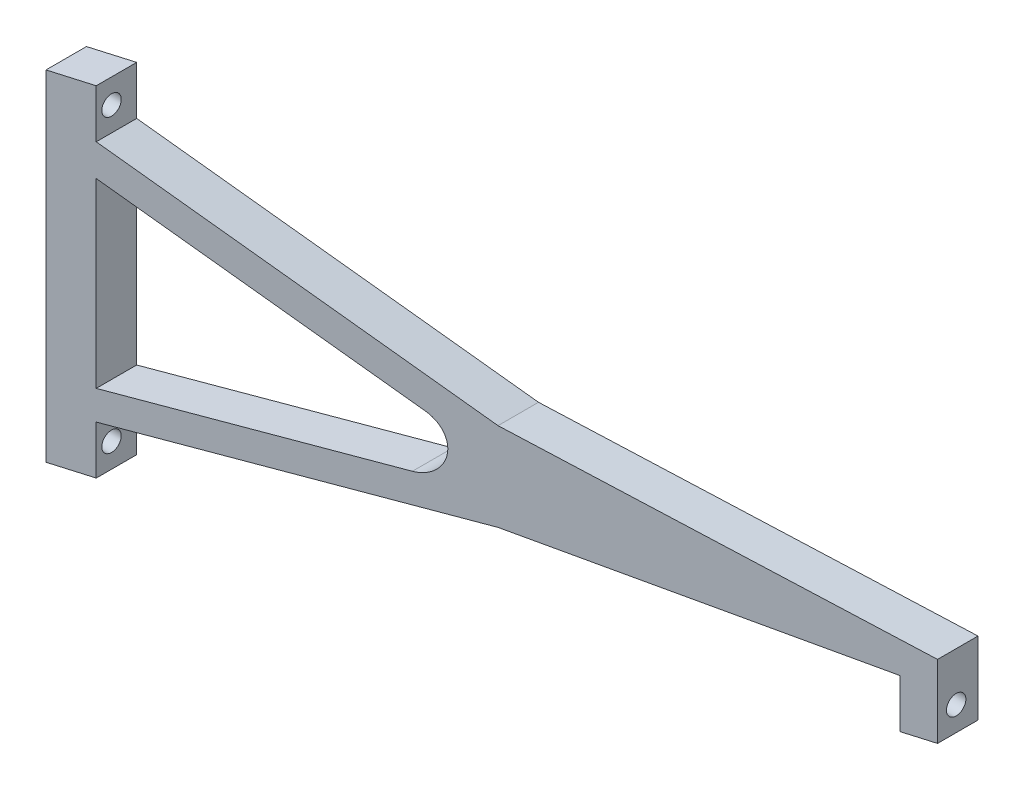
ISO-10303-21;
HEADER;
FILE_DESCRIPTION(('STEP AP214'),'2;1');
FILE_NAME('part.step','',(''),(''),'','','');
FILE_SCHEMA(('AUTOMOTIVE_DESIGN { 1 0 10303 214 1 1 1 1 }'));
ENDSEC;
DATA;
#1=APPLICATION_CONTEXT('core data for automotive mechanical design processes');
#2=APPLICATION_PROTOCOL_DEFINITION('international standard','automotive_design',2000,#1);
#3=PRODUCT_CONTEXT('',#1,'mechanical');
#4=PRODUCT('Part','Part','',(#3));
#5=PRODUCT_RELATED_PRODUCT_CATEGORY('part','',(#4));
#6=PRODUCT_DEFINITION_FORMATION('','',#4);
#7=PRODUCT_DEFINITION_CONTEXT('part definition',#1,'design');
#8=PRODUCT_DEFINITION('design','',#6,#7);
#9=PRODUCT_DEFINITION_SHAPE('','',#8);
#10=(LENGTH_UNIT() NAMED_UNIT(*) SI_UNIT(.MILLI.,.METRE.));
#11=(NAMED_UNIT(*) PLANE_ANGLE_UNIT() SI_UNIT($,.RADIAN.));
#12=(NAMED_UNIT(*) SI_UNIT($,.STERADIAN.) SOLID_ANGLE_UNIT());
#13=UNCERTAINTY_MEASURE_WITH_UNIT(LENGTH_MEASURE(1.E-05),#10,'distance_accuracy_value','');
#14=(GEOMETRIC_REPRESENTATION_CONTEXT(3) GLOBAL_UNCERTAINTY_ASSIGNED_CONTEXT((#13)) GLOBAL_UNIT_ASSIGNED_CONTEXT((#10,
#11,#12)) REPRESENTATION_CONTEXT('',''));
#15=CARTESIAN_POINT('',(0.,0.,0.));
#16=DIRECTION('',(0.,0.,1.));
#17=DIRECTION('',(1.,0.,0.));
#18=AXIS2_PLACEMENT_3D('',#15,#16,#17);
#19=CARTESIAN_POINT('',(-64.,16.0106379265945,30.));
#20=DIRECTION('',(-0.0594690450469109,0.99823015015637,0.));
#21=DIRECTION('',(-0.99823015015637,-0.0594690450469109,0.));
#22=AXIS2_PLACEMENT_3D('',#19,#20,#21);
#23=PLANE('',#22);
#24=DIRECTION('',(0.957987763405682,0.0570716256641193,-0.28107343294775));
#25=VECTOR('',#24,1.);
#26=CARTESIAN_POINT('',(-69.5695897519318,15.6788324969563,10.949691869991));
#27=LINE('',#26,#25);
#28=CARTESIAN_POINT('',(-64.,16.0106379265945,9.31557526486776));
#29=VERTEX_POINT('',#28);
#30=CARTESIAN_POINT('',(-13.6431857297185,19.0106190990618,-5.45910474664132));
#31=VERTEX_POINT('',#30);
#32=EDGE_CURVE('E11',#29,#31,#27,.T.);
#33=ORIENTED_EDGE('',*,*,#32,.F.);
#34=DIRECTION('',(0.,0.,-1.));
#35=VECTOR('',#34,1.);
#36=CARTESIAN_POINT('',(-64.,16.0106379265945,30.));
#37=LINE('',#36,#35);
#38=CARTESIAN_POINT('',(-64.,16.0106379265945,17.6528014767243));
#39=VERTEX_POINT('',#38);
#40=EDGE_CURVE('E237',#39,#29,#37,.T.);
#41=ORIENTED_EDGE('',*,*,#40,.F.);
#42=DIRECTION('',(-0.957987763405682,-0.0570716256641193,0.281073432947749));
#43=VECTOR('',#42,1.);
#44=CARTESIAN_POINT('',(-67.324667291496,15.8125725917687,18.6282582463471));
#45=LINE('',#44,#43);
#46=CARTESIAN_POINT('',(-13.6431857297185,19.0106190990618,2.87812146521523));
#47=VERTEX_POINT('',#46);
#48=EDGE_CURVE('E45',#47,#39,#45,.T.);
#49=ORIENTED_EDGE('',*,*,#48,.F.);
#50=DIRECTION('',(0.,0.,-1.));
#51=VECTOR('',#50,1.);
#52=CARTESIAN_POINT('',(-13.6431857297185,19.0106190990618,30.));
#53=LINE('',#52,#51);
#54=EDGE_CURVE('E234',#47,#31,#53,.T.);
#55=ORIENTED_EDGE('',*,*,#54,.T.);
#56=EDGE_LOOP('',(#33,#41,#49,#55));
#57=FACE_BOUND('',#56,.T.);
#58=ADVANCED_FACE('F37',(#57),#23,.T.);
#59=CARTESIAN_POINT('',(-64.,53.4497295583817,30.));
#60=DIRECTION('',(1.,0.,0.));
#61=DIRECTION('',(0.,0.,-1.));
#62=AXIS2_PLACEMENT_3D('',#59,#60,#61);
#63=PLANE('',#62);
#64=DIRECTION('',(0.,-1.,0.));
#65=VECTOR('',#64,1.);
#66=CARTESIAN_POINT('',(-64.,53.4497295583817,9.31557526486777));
#67=LINE('',#66,#65);
#68=CARTESIAN_POINT('',(-64.,53.4497295583817,9.31557526486777));
#69=VERTEX_POINT('',#68);
#70=EDGE_CURVE('E211',#69,#29,#67,.T.);
#71=ORIENTED_EDGE('',*,*,#70,.F.);
#72=DIRECTION('',(0.,0.,-1.));
#73=VECTOR('',#72,1.);
#74=CARTESIAN_POINT('',(-64.,53.4497295583817,30.));
#75=LINE('',#74,#73);
#76=CARTESIAN_POINT('',(-64.,53.4497295583817,17.6528014767243));
#77=VERTEX_POINT('',#76);
#78=EDGE_CURVE('E240',#77,#69,#75,.T.);
#79=ORIENTED_EDGE('',*,*,#78,.F.);
#80=DIRECTION('',(0.,1.,0.));
#81=VECTOR('',#80,1.);
#82=CARTESIAN_POINT('',(-64.,53.4497295583817,17.6528014767243));
#83=LINE('',#82,#81);
#84=EDGE_CURVE('E180',#39,#77,#83,.T.);
#85=ORIENTED_EDGE('',*,*,#84,.F.);
#86=ORIENTED_EDGE('',*,*,#40,.T.);
#87=EDGE_LOOP('',(#71,#79,#85,#86));
#88=FACE_BOUND('',#87,.T.);
#89=ADVANCED_FACE('F278',(#88),#63,.T.);
#90=CARTESIAN_POINT('',(-11.5928306007203,30.4959562846853,30.));
#91=DIRECTION('',(-0.401194899879948,-0.915992714114211,0.));
#92=DIRECTION('',(0.915992714114211,-0.401194899879948,0.));
#93=AXIS2_PLACEMENT_3D('',#90,#91,#92);
#94=PLANE('',#93);
#95=DIRECTION('',(-0.884603208938995,0.387446636174346,0.259542418213318));
#96=VECTOR('',#95,1.);
#97=CARTESIAN_POINT('',(-19.8720759330204,34.1221761781325,-3.63154951078674));
#98=LINE('',#97,#96);
#99=CARTESIAN_POINT('',(-11.5928306007203,30.4959562846853,-6.06067856301324));
#100=VERTEX_POINT('',#99);
#101=EDGE_CURVE('E213',#100,#69,#98,.T.);
#102=ORIENTED_EDGE('',*,*,#101,.F.);
#103=DIRECTION('',(0.,0.,-1.));
#104=VECTOR('',#103,1.);
#105=CARTESIAN_POINT('',(-11.5928306007203,30.4959562846853,30.));
#106=LINE('',#105,#104);
#107=CARTESIAN_POINT('',(-11.5928306007203,30.4959562846853,2.2765476488433));
#108=VERTEX_POINT('',#107);
#109=EDGE_CURVE('E243',#108,#100,#106,.T.);
#110=ORIENTED_EDGE('',*,*,#109,.F.);
#111=DIRECTION('',(0.884603208938995,-0.387446636174346,-0.259542418213318));
#112=VECTOR('',#111,1.);
#113=CARTESIAN_POINT('',(-17.9579150256424,33.2837944074519,4.14406224418109));
#114=LINE('',#113,#112);
#115=EDGE_CURVE('E183',#77,#108,#114,.T.);
#116=ORIENTED_EDGE('',*,*,#115,.F.);
#117=ORIENTED_EDGE('',*,*,#78,.T.);
#118=EDGE_LOOP('',(#102,#110,#116,#117));
#119=FACE_BOUND('',#118,.T.);
#120=ADVANCED_FACE('F281',(#119),#94,.T.);
#121=CARTESIAN_POINT('',(-14.,25.,30.));
#122=DIRECTION('',(0.,0.,-1.));
#123=DIRECTION('',(-1.,0.,0.));
#124=AXIS2_PLACEMENT_3D('',#121,#122,#123);
#125=CYLINDRICAL_SURFACE('',#124,6.);
#126=CARTESIAN_POINT('',(-14.,25.,-5.35441550560528));
#127=DIRECTION('',(0.281532306264845,0.,0.959551749792161));
#128=DIRECTION('',(0.959551749792161,0.,-0.281532306264845));
#129=AXIS2_PLACEMENT_3D('',#126,#127,#128);
#130=ELLIPSE('',#129,6.25291965889239,6.);
#131=EDGE_CURVE('E215',#31,#100,#130,.T.);
#132=ORIENTED_EDGE('',*,*,#131,.F.);
#133=ORIENTED_EDGE('',*,*,#54,.F.);
#134=CARTESIAN_POINT('',(-14.,25.,2.98281070625127));
#135=DIRECTION('',(-0.281532306264845,0.,-0.959551749792161));
#136=DIRECTION('',(0.959551749792161,0.,-0.281532306264845));
#137=AXIS2_PLACEMENT_3D('',#134,#135,#136);
#138=ELLIPSE('',#137,6.25291965889239,6.);
#139=EDGE_CURVE('E191',#108,#47,#138,.T.);
#140=ORIENTED_EDGE('',*,*,#139,.F.);
#141=ORIENTED_EDGE('',*,*,#109,.T.);
#142=EDGE_LOOP('',(#132,#133,#140,#141));
#143=FACE_BOUND('',#142,.T.);
#144=ADVANCED_FACE('F284',(#143),#125,.F.);
#145=CARTESIAN_POINT('',(70.,70.,-21.6627737881434));
#146=DIRECTION('',(-0.281532306264845,0.,-0.959551749792161));
#147=DIRECTION('',(-0.959551749792161,0.,0.281532306264845));
#148=AXIS2_PLACEMENT_3D('',#145,#146,#147);
#149=PLANE('',#148);
#150=ORIENTED_EDGE('',*,*,#139,.T.);
#151=ORIENTED_EDGE('',*,*,#48,.T.);
#152=ORIENTED_EDGE('',*,*,#84,.T.);
#153=ORIENTED_EDGE('',*,*,#115,.T.);
#154=EDGE_LOOP('',(#150,#151,#152,#153));
#155=FACE_BOUND('',#154,.T.);
#156=DIRECTION('',(0.884603208938995,-0.387446636174346,-0.259542418213318));
#157=VECTOR('',#156,1.);
#158=CARTESIAN_POINT('',(-7.14600377341808,35.0985646802269,0.971849478554998));
#159=LINE('',#158,#157);
#160=CARTESIAN_POINT('',(-64.,60.,17.6528014767243));
#161=VERTEX_POINT('',#160);
#162=CARTESIAN_POINT('',(0.,31.9686923305427,-1.12478670948118));
#163=VERTEX_POINT('',#162);
#164=EDGE_CURVE('E205',#161,#163,#159,.T.);
#165=ORIENTED_EDGE('',*,*,#164,.F.);
#166=DIRECTION('',(0.,-1.,0.));
#167=VECTOR('',#166,1.);
#168=CARTESIAN_POINT('',(-64.,60.,17.6528014767243));
#169=LINE('',#168,#167);
#170=CARTESIAN_POINT('',(-64.,70.,17.6528014767243));
#171=VERTEX_POINT('',#170);
#172=EDGE_CURVE('E202',#171,#161,#169,.T.);
#173=ORIENTED_EDGE('',*,*,#172,.F.);
#174=DIRECTION('',(0.959551749792161,0.,-0.281532306264845));
#175=VECTOR('',#174,1.);
#176=CARTESIAN_POINT('',(70.,70.,-21.6627737881434));
#177=LINE('',#176,#175);
#178=CARTESIAN_POINT('',(-72.,70.,20.));
#179=VERTEX_POINT('',#178);
#180=EDGE_CURVE('E172',#179,#171,#177,.T.);
#181=ORIENTED_EDGE('',*,*,#180,.F.);
#182=DIRECTION('',(0.,-1.,0.));
#183=VECTOR('',#182,1.);
#184=CARTESIAN_POINT('',(-72.,70.,20.));
#185=LINE('',#184,#183);
#186=CARTESIAN_POINT('',(-72.,0.,20.));
#187=VERTEX_POINT('',#186);
#188=EDGE_CURVE('E159',#179,#187,#185,.T.);
#189=ORIENTED_EDGE('',*,*,#188,.T.);
#190=DIRECTION('',(0.959551749792161,0.,-0.281532306264845));
#191=VECTOR('',#190,1.);
#192=CARTESIAN_POINT('',(70.,0.,-21.6627737881434));
#193=LINE('',#192,#191);
#194=CARTESIAN_POINT('',(-64.,0.,17.6528014767243));
#195=VERTEX_POINT('',#194);
#196=EDGE_CURVE('E173',#187,#195,#193,.T.);
#197=ORIENTED_EDGE('',*,*,#196,.T.);
#198=DIRECTION('',(0.,-1.,0.));
#199=VECTOR('',#198,1.);
#200=CARTESIAN_POINT('',(-64.,0.,17.6528014767243));
#201=LINE('',#200,#199);
#202=CARTESIAN_POINT('',(-64.,10.,17.6528014767243));
#203=VERTEX_POINT('',#202);
#204=EDGE_CURVE('E195',#203,#195,#201,.T.);
#205=ORIENTED_EDGE('',*,*,#204,.F.);
#206=DIRECTION('',(-0.957987763405682,-0.0570716256641194,0.281073432947749));
#207=VECTOR('',#206,1.);
#208=CARTESIAN_POINT('',(-67.324667291496,9.80193466517416,18.6282582463471));
#209=LINE('',#208,#207);
#210=CARTESIAN_POINT('',(0.,13.8127669079181,-1.12478670948117));
#211=VERTEX_POINT('',#210);
#212=EDGE_CURVE('E193',#211,#203,#209,.T.);
#213=ORIENTED_EDGE('',*,*,#212,.F.);
#214=DIRECTION('',(-0.957987763405682,0.0570716256641194,0.281073432947749));
#215=VECTOR('',#214,1.);
#216=CARTESIAN_POINT('',(-8.38081287287409,14.3120495014048,1.33414224040131));
#217=LINE('',#216,#215);
#218=CARTESIAN_POINT('',(64.,10.,-19.9023748956867));
#219=VERTEX_POINT('',#218);
#220=EDGE_CURVE('E197',#219,#211,#217,.T.);
#221=ORIENTED_EDGE('',*,*,#220,.F.);
#222=DIRECTION('',(0.,1.,0.));
#223=VECTOR('',#222,1.);
#224=CARTESIAN_POINT('',(64.,10.,-19.9023748956867));
#225=LINE('',#224,#223);
#226=CARTESIAN_POINT('',(64.,0.,-19.9023748956867));
#227=VERTEX_POINT('',#226);
#228=EDGE_CURVE('E199',#227,#219,#225,.T.);
#229=ORIENTED_EDGE('',*,*,#228,.F.);
#230=CARTESIAN_POINT('',(70.,0.,-21.6627737881434));
#231=VERTEX_POINT('',#230);
#232=EDGE_CURVE('E359',#227,#231,#193,.T.);
#233=ORIENTED_EDGE('',*,*,#232,.T.);
#234=DIRECTION('',(0.,-1.,0.));
#235=VECTOR('',#234,1.);
#236=CARTESIAN_POINT('',(70.,70.,-21.6627737881434));
#237=LINE('',#236,#235);
#238=CARTESIAN_POINT('',(70.,15.,-21.6627737881434));
#239=VERTEX_POINT('',#238);
#240=EDGE_CURVE('E185',#239,#231,#237,.T.);
#241=ORIENTED_EDGE('',*,*,#240,.F.);
#242=DIRECTION('',(0.934601477354737,-0.226556641727189,-0.274211900937289));
#243=VECTOR('',#242,1.);
#244=CARTESIAN_POINT('',(56.7599238633365,18.2095254056572,-17.7781378936391));
#245=LINE('',#244,#243);
#246=EDGE_CURVE('E208',#163,#239,#245,.T.);
#247=ORIENTED_EDGE('',*,*,#246,.F.);
#248=EDGE_LOOP('',(#165,#173,#181,#189,#197,#205,#213,#221,#229,#233,#241,#247));
#249=FACE_BOUND('',#248,.T.);
#250=ADVANCED_FACE('F270',(#155,#249),#149,.F.);
#251=CARTESIAN_POINT('',(-72.,70.,11.6627737881435));
#252=DIRECTION('',(0.281532306264845,0.,0.959551749792161));
#253=DIRECTION('',(0.959551749792161,0.,-0.281532306264845));
#254=AXIS2_PLACEMENT_3D('',#251,#252,#253);
#255=PLANE('',#254);
#256=ORIENTED_EDGE('',*,*,#131,.T.);
#257=ORIENTED_EDGE('',*,*,#101,.T.);
#258=ORIENTED_EDGE('',*,*,#70,.T.);
#259=ORIENTED_EDGE('',*,*,#32,.T.);
#260=EDGE_LOOP('',(#256,#257,#258,#259));
#261=FACE_BOUND('',#260,.T.);
#262=DIRECTION('',(0.,1.,0.));
#263=VECTOR('',#262,1.);
#264=CARTESIAN_POINT('',(70.,0.,-30.));
#265=LINE('',#264,#263);
#266=CARTESIAN_POINT('',(70.,0.,-30.));
#267=VERTEX_POINT('',#266);
#268=CARTESIAN_POINT('',(70.,15.,-30.));
#269=VERTEX_POINT('',#268);
#270=EDGE_CURVE('E246',#267,#269,#265,.T.);
#271=ORIENTED_EDGE('',*,*,#270,.F.);
#272=DIRECTION('',(-0.959551749792161,0.,0.281532306264845));
#273=VECTOR('',#272,1.);
#274=CARTESIAN_POINT('',(-72.,0.,11.6627737881435));
#275=LINE('',#274,#273);
#276=CARTESIAN_POINT('',(64.,0.,-28.2396011075432));
#277=VERTEX_POINT('',#276);
#278=EDGE_CURVE('E357',#267,#277,#275,.T.);
#279=ORIENTED_EDGE('',*,*,#278,.T.);
#280=DIRECTION('',(0.,-1.,0.));
#281=VECTOR('',#280,1.);
#282=CARTESIAN_POINT('',(64.,10.,-28.2396011075432));
#283=LINE('',#282,#281);
#284=CARTESIAN_POINT('',(64.,10.,-28.2396011075432));
#285=VERTEX_POINT('',#284);
#286=EDGE_CURVE('E223',#285,#277,#283,.T.);
#287=ORIENTED_EDGE('',*,*,#286,.F.);
#288=DIRECTION('',(0.957987763405682,-0.0570716256641194,-0.28107343294775));
#289=VECTOR('',#288,1.);
#290=CARTESIAN_POINT('',(-10.62573533331,14.4457895962171,-6.3444241359548));
#291=LINE('',#290,#289);
#292=CARTESIAN_POINT('',(0.,13.8127669079181,-9.46201292133772));
#293=VERTEX_POINT('',#292);
#294=EDGE_CURVE('E221',#293,#285,#291,.T.);
#295=ORIENTED_EDGE('',*,*,#294,.F.);
#296=DIRECTION('',(0.957987763405682,0.0570716256641194,-0.28107343294775));
#297=VECTOR('',#296,1.);
#298=CARTESIAN_POINT('',(-69.5695897519318,9.66819457036179,10.949691869991));
#299=LINE('',#298,#297);
#300=CARTESIAN_POINT('',(-64.,10.,9.31557526486777));
#301=VERTEX_POINT('',#300);
#302=EDGE_CURVE('E217',#301,#293,#299,.T.);
#303=ORIENTED_EDGE('',*,*,#302,.F.);
#304=DIRECTION('',(0.,1.,0.));
#305=VECTOR('',#304,1.);
#306=CARTESIAN_POINT('',(-64.,0.,9.31557526486777));
#307=LINE('',#306,#305);
#308=CARTESIAN_POINT('',(-64.,0.,9.31557526486776));
#309=VERTEX_POINT('',#308);
#310=EDGE_CURVE('E219',#309,#301,#307,.T.);
#311=ORIENTED_EDGE('',*,*,#310,.F.);
#312=CARTESIAN_POINT('',(-72.,0.,11.6627737881435));
#313=VERTEX_POINT('',#312);
#314=EDGE_CURVE('E179',#309,#313,#275,.T.);
#315=ORIENTED_EDGE('',*,*,#314,.T.);
#316=DIRECTION('',(0.,-1.,0.));
#317=VECTOR('',#316,1.);
#318=CARTESIAN_POINT('',(-72.,70.,11.6627737881435));
#319=LINE('',#318,#317);
#320=CARTESIAN_POINT('',(-72.,70.,11.6627737881435));
#321=VERTEX_POINT('',#320);
#322=EDGE_CURVE('E156',#321,#313,#319,.T.);
#323=ORIENTED_EDGE('',*,*,#322,.F.);
#324=DIRECTION('',(-0.959551749792161,0.,0.281532306264845));
#325=VECTOR('',#324,1.);
#326=CARTESIAN_POINT('',(-72.,70.,11.6627737881435));
#327=LINE('',#326,#325);
#328=CARTESIAN_POINT('',(-64.,70.,9.31557526486776));
#329=VERTEX_POINT('',#328);
#330=EDGE_CURVE('E167',#329,#321,#327,.T.);
#331=ORIENTED_EDGE('',*,*,#330,.F.);
#332=DIRECTION('',(0.,1.,0.));
#333=VECTOR('',#332,1.);
#334=CARTESIAN_POINT('',(-64.,60.,9.31557526486777));
#335=LINE('',#334,#333);
#336=CARTESIAN_POINT('',(-64.,60.,9.31557526486777));
#337=VERTEX_POINT('',#336);
#338=EDGE_CURVE('E226',#337,#329,#335,.T.);
#339=ORIENTED_EDGE('',*,*,#338,.F.);
#340=DIRECTION('',(-0.884603208938995,0.387446636174346,0.259542418213318));
#341=VECTOR('',#340,1.);
#342=CARTESIAN_POINT('',(-9.06016468079608,35.9369464509075,-6.80376227641284));
#343=LINE('',#342,#341);
#344=CARTESIAN_POINT('',(0.,31.9686923305427,-9.46201292133773));
#345=VERTEX_POINT('',#344);
#346=EDGE_CURVE('E228',#345,#337,#343,.T.);
#347=ORIENTED_EDGE('',*,*,#346,.F.);
#348=DIRECTION('',(-0.934601477354737,0.226556641727189,0.274211900937289));
#349=VECTOR('',#348,1.);
#350=CARTESIAN_POINT('',(54.6232691365455,18.7274716438789,-25.4884700030615));
#351=LINE('',#350,#349);
#352=EDGE_CURVE('E231',#269,#345,#351,.T.);
#353=ORIENTED_EDGE('',*,*,#352,.F.);
#354=EDGE_LOOP('',(#271,#279,#287,#295,#303,#311,#315,#323,#331,#339,#347,#353));
#355=FACE_BOUND('',#354,.T.);
#356=ADVANCED_FACE('F176',(#261,#355),#255,.F.);
#357=CARTESIAN_POINT('',(0.,13.8127669079181,30.));
#358=DIRECTION('',(0.0594690450469109,0.99823015015637,0.));
#359=DIRECTION('',(-0.99823015015637,0.0594690450469109,0.));
#360=AXIS2_PLACEMENT_3D('',#357,#358,#359);
#361=PLANE('',#360);
#362=DIRECTION('',(0.,0.,-1.));
#363=VECTOR('',#362,1.);
#364=CARTESIAN_POINT('',(0.,13.8127669079181,30.));
#365=LINE('',#364,#363);
#366=EDGE_CURVE('E60',#211,#293,#365,.T.);
#367=ORIENTED_EDGE('',*,*,#366,.T.);
#368=ORIENTED_EDGE('',*,*,#294,.T.);
#369=DIRECTION('',(0.,0.,-1.));
#370=VECTOR('',#369,1.);
#371=CARTESIAN_POINT('',(64.,10.,30.));
#372=LINE('',#371,#370);
#373=EDGE_CURVE('E265',#219,#285,#372,.T.);
#374=ORIENTED_EDGE('',*,*,#373,.F.);
#375=ORIENTED_EDGE('',*,*,#220,.T.);
#376=EDGE_LOOP('',(#367,#368,#374,#375));
#377=FACE_BOUND('',#376,.T.);
#378=ADVANCED_FACE('F39',(#377),#361,.F.);
#379=CARTESIAN_POINT('',(64.,10.,30.));
#380=DIRECTION('',(1.,0.,0.));
#381=DIRECTION('',(0.,0.,-1.));
#382=AXIS2_PLACEMENT_3D('',#379,#380,#381);
#383=PLANE('',#382);
#384=CARTESIAN_POINT('',(64.,5.,-25.5));
#385=DIRECTION('',(1.,0.,0.));
#386=DIRECTION('',(0.,0.,-1.));
#387=AXIS2_PLACEMENT_3D('',#384,#385,#386);
#388=CIRCLE('',#387,2.);
#389=CARTESIAN_POINT('',(64.,5.,-27.5));
#390=VERTEX_POINT('',#389);
#391=EDGE_CURVE('E349',#390,#390,#388,.F.);
#392=ORIENTED_EDGE('',*,*,#391,.F.);
#393=EDGE_LOOP('',(#392));
#394=FACE_BOUND('',#393,.T.);
#395=ORIENTED_EDGE('',*,*,#373,.T.);
#396=ORIENTED_EDGE('',*,*,#286,.T.);
#397=DIRECTION('',(0.,0.,-1.));
#398=VECTOR('',#397,1.);
#399=CARTESIAN_POINT('',(64.,0.,30.));
#400=LINE('',#399,#398);
#401=EDGE_CURVE('E263',#227,#277,#400,.T.);
#402=ORIENTED_EDGE('',*,*,#401,.F.);
#403=ORIENTED_EDGE('',*,*,#228,.T.);
#404=EDGE_LOOP('',(#395,#396,#402,#403));
#405=FACE_BOUND('',#404,.T.);
#406=ADVANCED_FACE('F292',(#394,#405),#383,.F.);
#407=CARTESIAN_POINT('',(64.,0.,30.));
#408=DIRECTION('',(0.,1.,0.));
#409=DIRECTION('',(0.,0.,1.));
#410=AXIS2_PLACEMENT_3D('',#407,#408,#409);
#411=PLANE('',#410);
#412=ORIENTED_EDGE('',*,*,#401,.T.);
#413=ORIENTED_EDGE('',*,*,#278,.F.);
#414=DIRECTION('',(0.,0.,-1.));
#415=VECTOR('',#414,1.);
#416=CARTESIAN_POINT('',(70.,0.,30.));
#417=LINE('',#416,#415);
#418=EDGE_CURVE('E261',#231,#267,#417,.T.);
#419=ORIENTED_EDGE('',*,*,#418,.F.);
#420=ORIENTED_EDGE('',*,*,#232,.F.);
#421=EDGE_LOOP('',(#412,#413,#419,#420));
#422=FACE_BOUND('',#421,.T.);
#423=ADVANCED_FACE('F338',(#422),#411,.F.);
#424=CARTESIAN_POINT('',(70.,0.,30.));
#425=DIRECTION('',(-1.,0.,0.));
#426=DIRECTION('',(0.,0.,1.));
#427=AXIS2_PLACEMENT_3D('',#424,#425,#426);
#428=PLANE('',#427);
#429=CARTESIAN_POINT('',(70.,5.,-25.5));
#430=DIRECTION('',(1.,0.,0.));
#431=DIRECTION('',(0.,0.,-1.));
#432=AXIS2_PLACEMENT_3D('',#429,#430,#431);
#433=CIRCLE('',#432,2.);
#434=CARTESIAN_POINT('',(70.,5.,-27.5));
#435=VERTEX_POINT('',#434);
#436=EDGE_CURVE('E391',#435,#435,#433,.T.);
#437=ORIENTED_EDGE('',*,*,#436,.F.);
#438=EDGE_LOOP('',(#437));
#439=FACE_BOUND('',#438,.T.);
#440=DIRECTION('',(0.,0.,-1.));
#441=VECTOR('',#440,1.);
#442=CARTESIAN_POINT('',(70.,15.,30.));
#443=LINE('',#442,#441);
#444=EDGE_CURVE('E259',#239,#269,#443,.T.);
#445=ORIENTED_EDGE('',*,*,#444,.F.);
#446=ORIENTED_EDGE('',*,*,#240,.T.);
#447=ORIENTED_EDGE('',*,*,#418,.T.);
#448=ORIENTED_EDGE('',*,*,#270,.T.);
#449=EDGE_LOOP('',(#445,#446,#447,#448));
#450=FACE_BOUND('',#449,.T.);
#451=ADVANCED_FACE('F334',(#439,#450),#428,.F.);
#452=CARTESIAN_POINT('',(70.,15.,30.));
#453=DIRECTION('',(-0.235586851791364,-0.971853299249961,0.));
#454=DIRECTION('',(0.971853299249961,-0.235586851791364,0.));
#455=AXIS2_PLACEMENT_3D('',#452,#453,#454);
#456=PLANE('',#455);
#457=ORIENTED_EDGE('',*,*,#444,.T.);
#458=ORIENTED_EDGE('',*,*,#352,.T.);
#459=DIRECTION('',(0.,0.,-1.));
#460=VECTOR('',#459,1.);
#461=CARTESIAN_POINT('',(0.,31.9686923305427,30.));
#462=LINE('',#461,#460);
#463=EDGE_CURVE('E257',#163,#345,#462,.T.);
#464=ORIENTED_EDGE('',*,*,#463,.F.);
#465=ORIENTED_EDGE('',*,*,#246,.T.);
#466=EDGE_LOOP('',(#457,#458,#464,#465));
#467=FACE_BOUND('',#466,.T.);
#468=ADVANCED_FACE('F330',(#467),#456,.F.);
#469=CARTESIAN_POINT('',(0.,31.9686923305427,30.));
#470=DIRECTION('',(-0.401194899879948,-0.915992714114211,0.));
#471=DIRECTION('',(0.915992714114211,-0.401194899879948,0.));
#472=AXIS2_PLACEMENT_3D('',#469,#470,#471);
#473=PLANE('',#472);
#474=ORIENTED_EDGE('',*,*,#463,.T.);
#475=ORIENTED_EDGE('',*,*,#346,.T.);
#476=DIRECTION('',(0.,0.,-1.));
#477=VECTOR('',#476,1.);
#478=CARTESIAN_POINT('',(-64.,60.,30.));
#479=LINE('',#478,#477);
#480=EDGE_CURVE('E255',#161,#337,#479,.T.);
#481=ORIENTED_EDGE('',*,*,#480,.F.);
#482=ORIENTED_EDGE('',*,*,#164,.T.);
#483=EDGE_LOOP('',(#474,#475,#481,#482));
#484=FACE_BOUND('',#483,.T.);
#485=ADVANCED_FACE('F326',(#484),#473,.F.);
#486=CARTESIAN_POINT('',(-64.,60.,30.));
#487=DIRECTION('',(-1.,0.,0.));
#488=DIRECTION('',(0.,0.,1.));
#489=AXIS2_PLACEMENT_3D('',#486,#487,#488);
#490=PLANE('',#489);
#491=CARTESIAN_POINT('',(-64.,65.,14.5));
#492=DIRECTION('',(1.,0.,0.));
#493=DIRECTION('',(0.,0.,-1.));
#494=AXIS2_PLACEMENT_3D('',#491,#492,#493);
#495=CIRCLE('',#494,2.);
#496=CARTESIAN_POINT('',(-64.,65.,12.5));
#497=VERTEX_POINT('',#496);
#498=EDGE_CURVE('E385',#497,#497,#495,.T.);
#499=ORIENTED_EDGE('',*,*,#498,.F.);
#500=EDGE_LOOP('',(#499));
#501=FACE_BOUND('',#500,.T.);
#502=ORIENTED_EDGE('',*,*,#480,.T.);
#503=ORIENTED_EDGE('',*,*,#338,.T.);
#504=DIRECTION('',(0.,0.,-1.));
#505=VECTOR('',#504,1.);
#506=CARTESIAN_POINT('',(-64.,70.,30.));
#507=LINE('',#506,#505);
#508=EDGE_CURVE('E163',#171,#329,#507,.T.);
#509=ORIENTED_EDGE('',*,*,#508,.F.);
#510=ORIENTED_EDGE('',*,*,#172,.T.);
#511=EDGE_LOOP('',(#502,#503,#509,#510));
#512=FACE_BOUND('',#511,.T.);
#513=ADVANCED_FACE('F323',(#501,#512),#490,.F.);
#514=CARTESIAN_POINT('',(-64.,70.,30.));
#515=DIRECTION('',(0.,-1.,0.));
#516=DIRECTION('',(0.,0.,-1.));
#517=AXIS2_PLACEMENT_3D('',#514,#515,#516);
#518=PLANE('',#517);
#519=ORIENTED_EDGE('',*,*,#508,.T.);
#520=ORIENTED_EDGE('',*,*,#330,.T.);
#521=DIRECTION('',(0.,0.,-1.));
#522=VECTOR('',#521,1.);
#523=CARTESIAN_POINT('',(-72.,70.,30.));
#524=LINE('',#523,#522);
#525=EDGE_CURVE('E152',#179,#321,#524,.T.);
#526=ORIENTED_EDGE('',*,*,#525,.F.);
#527=ORIENTED_EDGE('',*,*,#180,.T.);
#528=EDGE_LOOP('',(#519,#520,#526,#527));
#529=FACE_BOUND('',#528,.T.);
#530=ADVANCED_FACE('F168',(#529),#518,.F.);
#531=CARTESIAN_POINT('',(-72.,70.,30.));
#532=DIRECTION('',(1.,0.,0.));
#533=DIRECTION('',(0.,1.,0.));
#534=AXIS2_PLACEMENT_3D('',#531,#532,#533);
#535=PLANE('',#534);
#536=CARTESIAN_POINT('',(-72.,65.,14.5));
#537=DIRECTION('',(1.,0.,0.));
#538=DIRECTION('',(0.,0.,-1.));
#539=AXIS2_PLACEMENT_3D('',#536,#537,#538);
#540=CIRCLE('',#539,2.);
#541=CARTESIAN_POINT('',(-72.,65.,12.5));
#542=VERTEX_POINT('',#541);
#543=EDGE_CURVE('E363',#542,#542,#540,.T.);
#544=ORIENTED_EDGE('',*,*,#543,.T.);
#545=EDGE_LOOP('',(#544));
#546=FACE_BOUND('',#545,.T.);
#547=CARTESIAN_POINT('',(-72.,5.,14.5));
#548=DIRECTION('',(1.,0.,0.));
#549=DIRECTION('',(0.,0.,-1.));
#550=AXIS2_PLACEMENT_3D('',#547,#548,#549);
#551=CIRCLE('',#550,2.);
#552=CARTESIAN_POINT('',(-72.,5.,12.5));
#553=VERTEX_POINT('',#552);
#554=EDGE_CURVE('E382',#553,#553,#551,.T.);
#555=ORIENTED_EDGE('',*,*,#554,.T.);
#556=EDGE_LOOP('',(#555));
#557=FACE_BOUND('',#556,.T.);
#558=ORIENTED_EDGE('',*,*,#525,.T.);
#559=ORIENTED_EDGE('',*,*,#322,.T.);
#560=DIRECTION('',(0.,0.,-1.));
#561=VECTOR('',#560,1.);
#562=CARTESIAN_POINT('',(-72.,0.,30.));
#563=LINE('',#562,#561);
#564=EDGE_CURVE('E164',#187,#313,#563,.T.);
#565=ORIENTED_EDGE('',*,*,#564,.F.);
#566=ORIENTED_EDGE('',*,*,#188,.F.);
#567=EDGE_LOOP('',(#558,#559,#565,#566));
#568=FACE_BOUND('',#567,.T.);
#569=ADVANCED_FACE('F154',(#546,#557,#568),#535,.F.);
#570=CARTESIAN_POINT('',(-72.,0.,30.));
#571=DIRECTION('',(0.,1.,0.));
#572=DIRECTION('',(0.,0.,1.));
#573=AXIS2_PLACEMENT_3D('',#570,#571,#572);
#574=PLANE('',#573);
#575=ORIENTED_EDGE('',*,*,#564,.T.);
#576=ORIENTED_EDGE('',*,*,#314,.F.);
#577=DIRECTION('',(0.,0.,-1.));
#578=VECTOR('',#577,1.);
#579=CARTESIAN_POINT('',(-64.,0.,30.));
#580=LINE('',#579,#578);
#581=EDGE_CURVE('E251',#195,#309,#580,.T.);
#582=ORIENTED_EDGE('',*,*,#581,.F.);
#583=ORIENTED_EDGE('',*,*,#196,.F.);
#584=EDGE_LOOP('',(#575,#576,#582,#583));
#585=FACE_BOUND('',#584,.T.);
#586=ADVANCED_FACE('F313',(#585),#574,.F.);
#587=CARTESIAN_POINT('',(-64.,0.,30.));
#588=DIRECTION('',(-1.,0.,0.));
#589=DIRECTION('',(0.,0.,1.));
#590=AXIS2_PLACEMENT_3D('',#587,#588,#589);
#591=PLANE('',#590);
#592=CARTESIAN_POINT('',(-64.,5.,14.5));
#593=DIRECTION('',(1.,0.,0.));
#594=DIRECTION('',(0.,0.,-1.));
#595=AXIS2_PLACEMENT_3D('',#592,#593,#594);
#596=CIRCLE('',#595,2.);
#597=CARTESIAN_POINT('',(-64.,5.,12.5));
#598=VERTEX_POINT('',#597);
#599=EDGE_CURVE('E379',#598,#598,#596,.T.);
#600=ORIENTED_EDGE('',*,*,#599,.F.);
#601=EDGE_LOOP('',(#600));
#602=FACE_BOUND('',#601,.T.);
#603=ORIENTED_EDGE('',*,*,#581,.T.);
#604=ORIENTED_EDGE('',*,*,#310,.T.);
#605=DIRECTION('',(0.,0.,-1.));
#606=VECTOR('',#605,1.);
#607=CARTESIAN_POINT('',(-64.,10.,30.));
#608=LINE('',#607,#606);
#609=EDGE_CURVE('E52',#203,#301,#608,.T.);
#610=ORIENTED_EDGE('',*,*,#609,.F.);
#611=ORIENTED_EDGE('',*,*,#204,.T.);
#612=EDGE_LOOP('',(#603,#604,#610,#611));
#613=FACE_BOUND('',#612,.T.);
#614=ADVANCED_FACE('F309',(#602,#613),#591,.F.);
#615=CARTESIAN_POINT('',(-64.,10.,30.));
#616=DIRECTION('',(-0.059469045046911,0.99823015015637,0.));
#617=DIRECTION('',(-0.99823015015637,-0.059469045046911,0.));
#618=AXIS2_PLACEMENT_3D('',#615,#616,#617);
#619=PLANE('',#618);
#620=ORIENTED_EDGE('',*,*,#609,.T.);
#621=ORIENTED_EDGE('',*,*,#302,.T.);
#622=ORIENTED_EDGE('',*,*,#366,.F.);
#623=ORIENTED_EDGE('',*,*,#212,.T.);
#624=EDGE_LOOP('',(#620,#621,#622,#623));
#625=FACE_BOUND('',#624,.T.);
#626=ADVANCED_FACE('F305',(#625),#619,.F.);
#627=CARTESIAN_POINT('',(-72.,5.,14.5));
#628=DIRECTION('',(1.,0.,0.));
#629=DIRECTION('',(0.,0.,-1.));
#630=AXIS2_PLACEMENT_3D('',#627,#628,#629);
#631=CYLINDRICAL_SURFACE('',#630,2.);
#632=ORIENTED_EDGE('',*,*,#554,.F.);
#633=EDGE_LOOP('',(#632));
#634=FACE_BOUND('',#633,.T.);
#635=ORIENTED_EDGE('',*,*,#599,.T.);
#636=EDGE_LOOP('',(#635));
#637=FACE_BOUND('',#636,.T.);
#638=ADVANCED_FACE('F308',(#634,#637),#631,.F.);
#639=CARTESIAN_POINT('',(-72.,65.,14.5));
#640=DIRECTION('',(1.,0.,0.));
#641=DIRECTION('',(0.,0.,-1.));
#642=AXIS2_PLACEMENT_3D('',#639,#640,#641);
#643=CYLINDRICAL_SURFACE('',#642,2.);
#644=ORIENTED_EDGE('',*,*,#543,.F.);
#645=EDGE_LOOP('',(#644));
#646=FACE_BOUND('',#645,.T.);
#647=ORIENTED_EDGE('',*,*,#498,.T.);
#648=EDGE_LOOP('',(#647));
#649=FACE_BOUND('',#648,.T.);
#650=ADVANCED_FACE('F398',(#646,#649),#643,.F.);
#651=CARTESIAN_POINT('',(-72.001,5.,-25.5));
#652=DIRECTION('',(1.,0.,0.));
#653=DIRECTION('',(0.,0.,-1.));
#654=AXIS2_PLACEMENT_3D('',#651,#652,#653);
#655=CYLINDRICAL_SURFACE('',#654,2.);
#656=ORIENTED_EDGE('',*,*,#436,.T.);
#657=EDGE_LOOP('',(#656));
#658=FACE_BOUND('',#657,.T.);
#659=ORIENTED_EDGE('',*,*,#391,.T.);
#660=EDGE_LOOP('',(#659));
#661=FACE_BOUND('',#660,.T.);
#662=ADVANCED_FACE('F395',(#658,#661),#655,.F.);
#663=CLOSED_SHELL('',(#58,#89,#120,#144,#250,#356,#378,#406,#423,#451,#468,#485,#513,#530,#569,
#586,#614,#626,#638,#650,#662));
#664=MANIFOLD_SOLID_BREP('B2',#663);
#665=ADVANCED_BREP_SHAPE_REPRESENTATION('',(#18,#664),#14);
#666=SHAPE_DEFINITION_REPRESENTATION(#9,#665);
ENDSEC;
END-ISO-10303-21;
